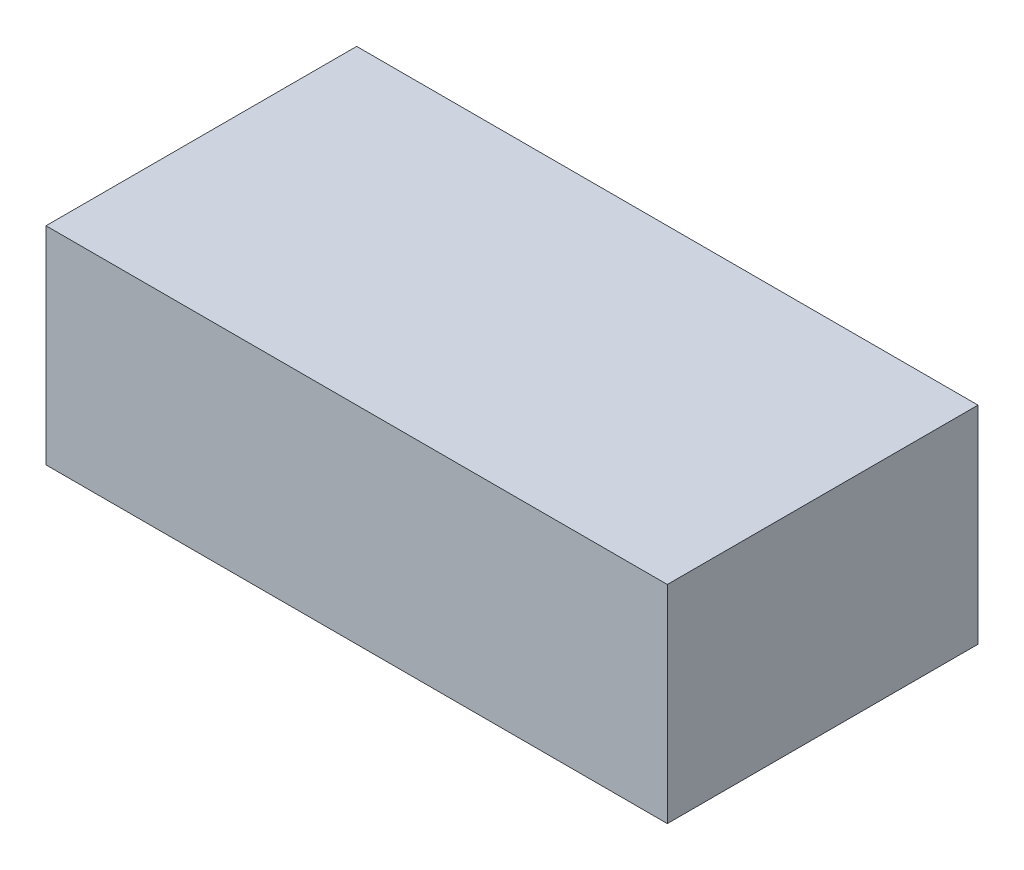
ISO-10303-21;
HEADER;
FILE_DESCRIPTION(('STEP AP214'),'2;1');
FILE_NAME('part.step','',(''),(''),'','','');
FILE_SCHEMA(('AUTOMOTIVE_DESIGN { 1 0 10303 214 1 1 1 1 }'));
ENDSEC;
DATA;
#1=APPLICATION_CONTEXT('core data for automotive mechanical design processes');
#2=APPLICATION_PROTOCOL_DEFINITION('international standard','automotive_design',2000,#1);
#3=PRODUCT_CONTEXT('',#1,'mechanical');
#4=PRODUCT('Part','Part','',(#3));
#5=PRODUCT_RELATED_PRODUCT_CATEGORY('part','',(#4));
#6=PRODUCT_DEFINITION_FORMATION('','',#4);
#7=PRODUCT_DEFINITION_CONTEXT('part definition',#1,'design');
#8=PRODUCT_DEFINITION('design','',#6,#7);
#9=PRODUCT_DEFINITION_SHAPE('','',#8);
#10=(LENGTH_UNIT() NAMED_UNIT(*) SI_UNIT(.MILLI.,.METRE.));
#11=(NAMED_UNIT(*) PLANE_ANGLE_UNIT() SI_UNIT($,.RADIAN.));
#12=(NAMED_UNIT(*) SI_UNIT($,.STERADIAN.) SOLID_ANGLE_UNIT());
#13=UNCERTAINTY_MEASURE_WITH_UNIT(LENGTH_MEASURE(1.E-05),#10,'distance_accuracy_value','');
#14=(GEOMETRIC_REPRESENTATION_CONTEXT(3) GLOBAL_UNCERTAINTY_ASSIGNED_CONTEXT((#13)) GLOBAL_UNIT_ASSIGNED_CONTEXT((#10,
#11,#12)) REPRESENTATION_CONTEXT('',''));
#15=CARTESIAN_POINT('',(0.,0.,0.));
#16=DIRECTION('',(0.,0.,1.));
#17=DIRECTION('',(1.,0.,0.));
#18=AXIS2_PLACEMENT_3D('',#15,#16,#17);
#19=CARTESIAN_POINT('',(30.,20.,-15.));
#20=DIRECTION('',(-1.,0.,0.));
#21=DIRECTION('',(0.,0.,1.));
#22=AXIS2_PLACEMENT_3D('',#19,#20,#21);
#23=PLANE('',#22);
#24=DIRECTION('',(0.,0.,-1.));
#25=VECTOR('',#24,1.);
#26=CARTESIAN_POINT('',(30.,0.,-15.));
#27=LINE('',#26,#25);
#28=CARTESIAN_POINT('',(30.,0.,15.));
#29=VERTEX_POINT('',#28);
#30=CARTESIAN_POINT('',(30.,0.,-15.));
#31=VERTEX_POINT('',#30);
#32=EDGE_CURVE('E96',#29,#31,#27,.T.);
#33=ORIENTED_EDGE('',*,*,#32,.T.);
#34=DIRECTION('',(0.,-1.,0.));
#35=VECTOR('',#34,1.);
#36=CARTESIAN_POINT('',(30.,20.,-15.));
#37=LINE('',#36,#35);
#38=CARTESIAN_POINT('',(30.,20.,-15.));
#39=VERTEX_POINT('',#38);
#40=EDGE_CURVE('E11',#39,#31,#37,.T.);
#41=ORIENTED_EDGE('',*,*,#40,.F.);
#42=DIRECTION('',(0.,0.,-1.));
#43=VECTOR('',#42,1.);
#44=CARTESIAN_POINT('',(30.,20.,-15.));
#45=LINE('',#44,#43);
#46=CARTESIAN_POINT('',(30.,20.,15.));
#47=VERTEX_POINT('',#46);
#48=EDGE_CURVE('E84',#47,#39,#45,.T.);
#49=ORIENTED_EDGE('',*,*,#48,.F.);
#50=DIRECTION('',(0.,-1.,0.));
#51=VECTOR('',#50,1.);
#52=CARTESIAN_POINT('',(30.,20.,15.));
#53=LINE('',#52,#51);
#54=EDGE_CURVE('E92',#47,#29,#53,.T.);
#55=ORIENTED_EDGE('',*,*,#54,.T.);
#56=EDGE_LOOP('',(#33,#41,#49,#55));
#57=FACE_BOUND('',#56,.T.);
#58=ADVANCED_FACE('F33',(#57),#23,.F.);
#59=CARTESIAN_POINT('',(-30.,20.,-15.));
#60=DIRECTION('',(0.,0.,1.));
#61=DIRECTION('',(1.,0.,0.));
#62=AXIS2_PLACEMENT_3D('',#59,#60,#61);
#63=PLANE('',#62);
#64=DIRECTION('',(-1.,0.,0.));
#65=VECTOR('',#64,1.);
#66=CARTESIAN_POINT('',(-30.,0.,-15.));
#67=LINE('',#66,#65);
#68=CARTESIAN_POINT('',(-30.,0.,-15.));
#69=VERTEX_POINT('',#68);
#70=EDGE_CURVE('E88',#31,#69,#67,.T.);
#71=ORIENTED_EDGE('',*,*,#70,.T.);
#72=DIRECTION('',(0.,-1.,0.));
#73=VECTOR('',#72,1.);
#74=CARTESIAN_POINT('',(-30.,20.,-15.));
#75=LINE('',#74,#73);
#76=CARTESIAN_POINT('',(-30.,20.,-15.));
#77=VERTEX_POINT('',#76);
#78=EDGE_CURVE('E41',#77,#69,#75,.T.);
#79=ORIENTED_EDGE('',*,*,#78,.F.);
#80=DIRECTION('',(-1.,0.,0.));
#81=VECTOR('',#80,1.);
#82=CARTESIAN_POINT('',(-30.,20.,-15.));
#83=LINE('',#82,#81);
#84=EDGE_CURVE('E79',#39,#77,#83,.T.);
#85=ORIENTED_EDGE('',*,*,#84,.F.);
#86=ORIENTED_EDGE('',*,*,#40,.T.);
#87=EDGE_LOOP('',(#71,#79,#85,#86));
#88=FACE_BOUND('',#87,.T.);
#89=ADVANCED_FACE('F87',(#88),#63,.F.);
#90=CARTESIAN_POINT('',(-30.,20.,-15.));
#91=DIRECTION('',(1.,0.,0.));
#92=DIRECTION('',(0.,0.,-1.));
#93=AXIS2_PLACEMENT_3D('',#90,#91,#92);
#94=PLANE('',#93);
#95=DIRECTION('',(0.,0.,1.));
#96=VECTOR('',#95,1.);
#97=CARTESIAN_POINT('',(-30.,0.,-15.));
#98=LINE('',#97,#96);
#99=CARTESIAN_POINT('',(-30.,0.,15.));
#100=VERTEX_POINT('',#99);
#101=EDGE_CURVE('E66',#69,#100,#98,.T.);
#102=ORIENTED_EDGE('',*,*,#101,.T.);
#103=DIRECTION('',(0.,-1.,0.));
#104=VECTOR('',#103,1.);
#105=CARTESIAN_POINT('',(-30.,20.,15.));
#106=LINE('',#105,#104);
#107=CARTESIAN_POINT('',(-30.,20.,15.));
#108=VERTEX_POINT('',#107);
#109=EDGE_CURVE('E89',#108,#100,#106,.T.);
#110=ORIENTED_EDGE('',*,*,#109,.F.);
#111=DIRECTION('',(0.,0.,1.));
#112=VECTOR('',#111,1.);
#113=CARTESIAN_POINT('',(-30.,20.,-15.));
#114=LINE('',#113,#112);
#115=EDGE_CURVE('E82',#77,#108,#114,.T.);
#116=ORIENTED_EDGE('',*,*,#115,.F.);
#117=ORIENTED_EDGE('',*,*,#78,.T.);
#118=EDGE_LOOP('',(#102,#110,#116,#117));
#119=FACE_BOUND('',#118,.T.);
#120=ADVANCED_FACE('F90',(#119),#94,.F.);
#121=CARTESIAN_POINT('',(-30.,20.,15.));
#122=DIRECTION('',(0.,0.,-1.));
#123=DIRECTION('',(-1.,0.,0.));
#124=AXIS2_PLACEMENT_3D('',#121,#122,#123);
#125=PLANE('',#124);
#126=DIRECTION('',(1.,0.,0.));
#127=VECTOR('',#126,1.);
#128=CARTESIAN_POINT('',(-30.,0.,15.));
#129=LINE('',#128,#127);
#130=EDGE_CURVE('E72',#100,#29,#129,.T.);
#131=ORIENTED_EDGE('',*,*,#130,.T.);
#132=ORIENTED_EDGE('',*,*,#54,.F.);
#133=DIRECTION('',(1.,0.,0.));
#134=VECTOR('',#133,1.);
#135=CARTESIAN_POINT('',(-30.,20.,15.));
#136=LINE('',#135,#134);
#137=EDGE_CURVE('E49',#108,#47,#136,.T.);
#138=ORIENTED_EDGE('',*,*,#137,.F.);
#139=ORIENTED_EDGE('',*,*,#109,.T.);
#140=EDGE_LOOP('',(#131,#132,#138,#139));
#141=FACE_BOUND('',#140,.T.);
#142=ADVANCED_FACE('F103',(#141),#125,.F.);
#143=CARTESIAN_POINT('',(0.,20.,0.));
#144=DIRECTION('',(0.,1.,0.));
#145=DIRECTION('',(0.,0.,1.));
#146=AXIS2_PLACEMENT_3D('',#143,#144,#145);
#147=PLANE('',#146);
#148=ORIENTED_EDGE('',*,*,#48,.T.);
#149=ORIENTED_EDGE('',*,*,#84,.T.);
#150=ORIENTED_EDGE('',*,*,#115,.T.);
#151=ORIENTED_EDGE('',*,*,#137,.T.);
#152=EDGE_LOOP('',(#148,#149,#150,#151));
#153=FACE_BOUND('',#152,.T.);
#154=ADVANCED_FACE('F80',(#153),#147,.T.);
#155=CARTESIAN_POINT('',(0.,0.,0.));
#156=DIRECTION('',(0.,1.,0.));
#157=DIRECTION('',(0.,0.,1.));
#158=AXIS2_PLACEMENT_3D('',#155,#156,#157);
#159=PLANE('',#158);
#160=ORIENTED_EDGE('',*,*,#32,.F.);
#161=ORIENTED_EDGE('',*,*,#130,.F.);
#162=ORIENTED_EDGE('',*,*,#101,.F.);
#163=ORIENTED_EDGE('',*,*,#70,.F.);
#164=EDGE_LOOP('',(#160,#161,#162,#163));
#165=FACE_BOUND('',#164,.T.);
#166=ADVANCED_FACE('F106',(#165),#159,.F.);
#167=CLOSED_SHELL('',(#58,#89,#120,#142,#154,#166));
#168=MANIFOLD_SOLID_BREP('B2',#167);
#169=ADVANCED_BREP_SHAPE_REPRESENTATION('',(#18,#168),#14);
#170=SHAPE_DEFINITION_REPRESENTATION(#9,#169);
ENDSEC;
END-ISO-10303-21;
